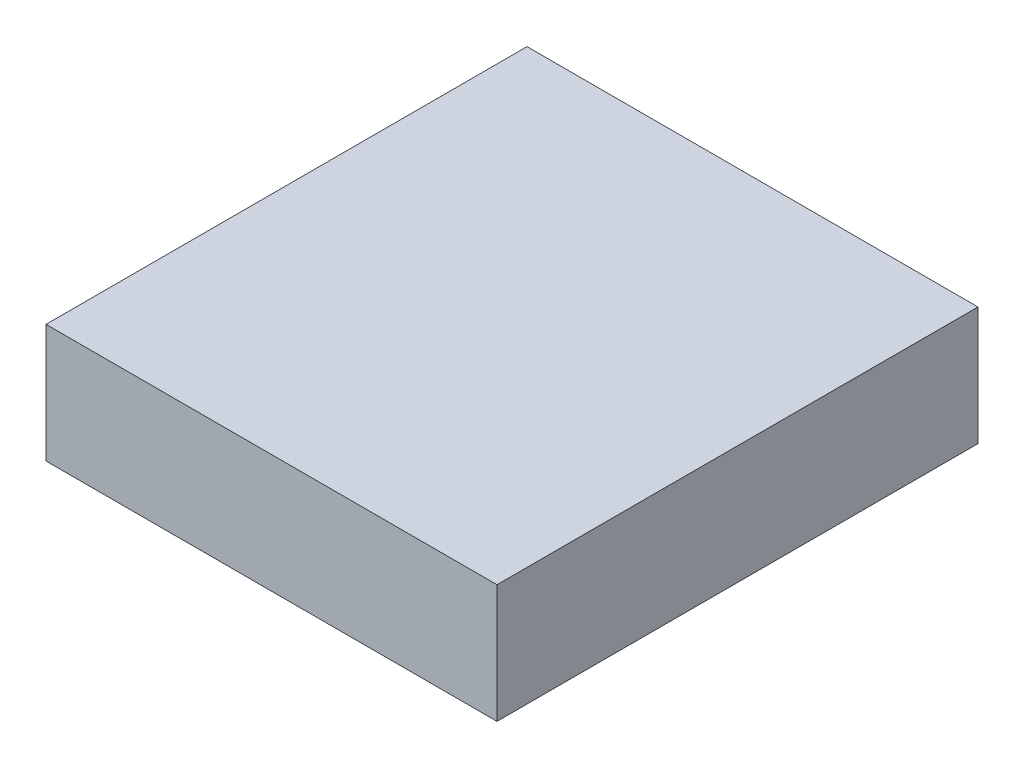
ISO-10303-21;
HEADER;
FILE_DESCRIPTION(('STEP AP214'),'2;1');
FILE_NAME('part.step','',(''),(''),'','','');
FILE_SCHEMA(('AUTOMOTIVE_DESIGN { 1 0 10303 214 1 1 1 1 }'));
ENDSEC;
DATA;
#1=APPLICATION_CONTEXT('core data for automotive mechanical design processes');
#2=APPLICATION_PROTOCOL_DEFINITION('international standard','automotive_design',2000,#1);
#3=PRODUCT_CONTEXT('',#1,'mechanical');
#4=PRODUCT('Part','Part','',(#3));
#5=PRODUCT_RELATED_PRODUCT_CATEGORY('part','',(#4));
#6=PRODUCT_DEFINITION_FORMATION('','',#4);
#7=PRODUCT_DEFINITION_CONTEXT('part definition',#1,'design');
#8=PRODUCT_DEFINITION('design','',#6,#7);
#9=PRODUCT_DEFINITION_SHAPE('','',#8);
#10=(LENGTH_UNIT() NAMED_UNIT(*) SI_UNIT(.MILLI.,.METRE.));
#11=(NAMED_UNIT(*) PLANE_ANGLE_UNIT() SI_UNIT($,.RADIAN.));
#12=(NAMED_UNIT(*) SI_UNIT($,.STERADIAN.) SOLID_ANGLE_UNIT());
#13=UNCERTAINTY_MEASURE_WITH_UNIT(LENGTH_MEASURE(1.E-05),#10,'distance_accuracy_value','');
#14=(GEOMETRIC_REPRESENTATION_CONTEXT(3) GLOBAL_UNCERTAINTY_ASSIGNED_CONTEXT((#13)) GLOBAL_UNIT_ASSIGNED_CONTEXT((#10,
#11,#12)) REPRESENTATION_CONTEXT('',''));
#15=CARTESIAN_POINT('',(0.,0.,0.));
#16=DIRECTION('',(0.,0.,1.));
#17=DIRECTION('',(1.,0.,0.));
#18=AXIS2_PLACEMENT_3D('',#15,#16,#17);
#19=CARTESIAN_POINT('',(47.625,25.,-50.8));
#20=DIRECTION('',(-1.,0.,0.));
#21=DIRECTION('',(0.,0.,1.));
#22=AXIS2_PLACEMENT_3D('',#19,#20,#21);
#23=PLANE('',#22);
#24=DIRECTION('',(0.,0.,-1.));
#25=VECTOR('',#24,1.);
#26=CARTESIAN_POINT('',(47.625,0.,-50.8));
#27=LINE('',#26,#25);
#28=CARTESIAN_POINT('',(47.625,0.,50.8));
#29=VERTEX_POINT('',#28);
#30=CARTESIAN_POINT('',(47.625,0.,-50.8));
#31=VERTEX_POINT('',#30);
#32=EDGE_CURVE('E96',#29,#31,#27,.T.);
#33=ORIENTED_EDGE('',*,*,#32,.T.);
#34=DIRECTION('',(0.,-1.,0.));
#35=VECTOR('',#34,1.);
#36=CARTESIAN_POINT('',(47.625,25.,-50.8));
#37=LINE('',#36,#35);
#38=CARTESIAN_POINT('',(47.625,25.,-50.8));
#39=VERTEX_POINT('',#38);
#40=EDGE_CURVE('E11',#39,#31,#37,.T.);
#41=ORIENTED_EDGE('',*,*,#40,.F.);
#42=DIRECTION('',(0.,0.,-1.));
#43=VECTOR('',#42,1.);
#44=CARTESIAN_POINT('',(47.625,25.,-50.8));
#45=LINE('',#44,#43);
#46=CARTESIAN_POINT('',(47.625,25.,50.8));
#47=VERTEX_POINT('',#46);
#48=EDGE_CURVE('E84',#47,#39,#45,.T.);
#49=ORIENTED_EDGE('',*,*,#48,.F.);
#50=DIRECTION('',(0.,-1.,0.));
#51=VECTOR('',#50,1.);
#52=CARTESIAN_POINT('',(47.625,25.,50.8));
#53=LINE('',#52,#51);
#54=EDGE_CURVE('E92',#47,#29,#53,.T.);
#55=ORIENTED_EDGE('',*,*,#54,.T.);
#56=EDGE_LOOP('',(#33,#41,#49,#55));
#57=FACE_BOUND('',#56,.T.);
#58=ADVANCED_FACE('F33',(#57),#23,.F.);
#59=CARTESIAN_POINT('',(-47.625,25.,-50.8));
#60=DIRECTION('',(0.,0.,1.));
#61=DIRECTION('',(1.,0.,0.));
#62=AXIS2_PLACEMENT_3D('',#59,#60,#61);
#63=PLANE('',#62);
#64=DIRECTION('',(-1.,0.,0.));
#65=VECTOR('',#64,1.);
#66=CARTESIAN_POINT('',(-47.625,0.,-50.8));
#67=LINE('',#66,#65);
#68=CARTESIAN_POINT('',(-47.625,0.,-50.8));
#69=VERTEX_POINT('',#68);
#70=EDGE_CURVE('E88',#31,#69,#67,.T.);
#71=ORIENTED_EDGE('',*,*,#70,.T.);
#72=DIRECTION('',(0.,-1.,0.));
#73=VECTOR('',#72,1.);
#74=CARTESIAN_POINT('',(-47.625,25.,-50.8));
#75=LINE('',#74,#73);
#76=CARTESIAN_POINT('',(-47.625,25.,-50.8));
#77=VERTEX_POINT('',#76);
#78=EDGE_CURVE('E41',#77,#69,#75,.T.);
#79=ORIENTED_EDGE('',*,*,#78,.F.);
#80=DIRECTION('',(-1.,0.,0.));
#81=VECTOR('',#80,1.);
#82=CARTESIAN_POINT('',(-47.625,25.,-50.8));
#83=LINE('',#82,#81);
#84=EDGE_CURVE('E79',#39,#77,#83,.T.);
#85=ORIENTED_EDGE('',*,*,#84,.F.);
#86=ORIENTED_EDGE('',*,*,#40,.T.);
#87=EDGE_LOOP('',(#71,#79,#85,#86));
#88=FACE_BOUND('',#87,.T.);
#89=ADVANCED_FACE('F87',(#88),#63,.F.);
#90=CARTESIAN_POINT('',(-47.625,25.,-50.8));
#91=DIRECTION('',(1.,0.,0.));
#92=DIRECTION('',(0.,0.,-1.));
#93=AXIS2_PLACEMENT_3D('',#90,#91,#92);
#94=PLANE('',#93);
#95=DIRECTION('',(0.,0.,1.));
#96=VECTOR('',#95,1.);
#97=CARTESIAN_POINT('',(-47.625,0.,-50.8));
#98=LINE('',#97,#96);
#99=CARTESIAN_POINT('',(-47.625,0.,50.8));
#100=VERTEX_POINT('',#99);
#101=EDGE_CURVE('E66',#69,#100,#98,.T.);
#102=ORIENTED_EDGE('',*,*,#101,.T.);
#103=DIRECTION('',(0.,-1.,0.));
#104=VECTOR('',#103,1.);
#105=CARTESIAN_POINT('',(-47.625,25.,50.8));
#106=LINE('',#105,#104);
#107=CARTESIAN_POINT('',(-47.625,25.,50.8));
#108=VERTEX_POINT('',#107);
#109=EDGE_CURVE('E89',#108,#100,#106,.T.);
#110=ORIENTED_EDGE('',*,*,#109,.F.);
#111=DIRECTION('',(0.,0.,1.));
#112=VECTOR('',#111,1.);
#113=CARTESIAN_POINT('',(-47.625,25.,-50.8));
#114=LINE('',#113,#112);
#115=EDGE_CURVE('E82',#77,#108,#114,.T.);
#116=ORIENTED_EDGE('',*,*,#115,.F.);
#117=ORIENTED_EDGE('',*,*,#78,.T.);
#118=EDGE_LOOP('',(#102,#110,#116,#117));
#119=FACE_BOUND('',#118,.T.);
#120=ADVANCED_FACE('F90',(#119),#94,.F.);
#121=CARTESIAN_POINT('',(-47.625,25.,50.8));
#122=DIRECTION('',(0.,0.,-1.));
#123=DIRECTION('',(-1.,0.,0.));
#124=AXIS2_PLACEMENT_3D('',#121,#122,#123);
#125=PLANE('',#124);
#126=DIRECTION('',(1.,0.,0.));
#127=VECTOR('',#126,1.);
#128=CARTESIAN_POINT('',(-47.625,0.,50.8));
#129=LINE('',#128,#127);
#130=EDGE_CURVE('E72',#100,#29,#129,.T.);
#131=ORIENTED_EDGE('',*,*,#130,.T.);
#132=ORIENTED_EDGE('',*,*,#54,.F.);
#133=DIRECTION('',(1.,0.,0.));
#134=VECTOR('',#133,1.);
#135=CARTESIAN_POINT('',(-47.625,25.,50.8));
#136=LINE('',#135,#134);
#137=EDGE_CURVE('E49',#108,#47,#136,.T.);
#138=ORIENTED_EDGE('',*,*,#137,.F.);
#139=ORIENTED_EDGE('',*,*,#109,.T.);
#140=EDGE_LOOP('',(#131,#132,#138,#139));
#141=FACE_BOUND('',#140,.T.);
#142=ADVANCED_FACE('F103',(#141),#125,.F.);
#143=CARTESIAN_POINT('',(0.,25.,0.));
#144=DIRECTION('',(0.,1.,0.));
#145=DIRECTION('',(0.,0.,1.));
#146=AXIS2_PLACEMENT_3D('',#143,#144,#145);
#147=PLANE('',#146);
#148=ORIENTED_EDGE('',*,*,#48,.T.);
#149=ORIENTED_EDGE('',*,*,#84,.T.);
#150=ORIENTED_EDGE('',*,*,#115,.T.);
#151=ORIENTED_EDGE('',*,*,#137,.T.);
#152=EDGE_LOOP('',(#148,#149,#150,#151));
#153=FACE_BOUND('',#152,.T.);
#154=ADVANCED_FACE('F80',(#153),#147,.T.);
#155=CARTESIAN_POINT('',(0.,0.,0.));
#156=DIRECTION('',(0.,1.,0.));
#157=DIRECTION('',(0.,0.,1.));
#158=AXIS2_PLACEMENT_3D('',#155,#156,#157);
#159=PLANE('',#158);
#160=ORIENTED_EDGE('',*,*,#32,.F.);
#161=ORIENTED_EDGE('',*,*,#130,.F.);
#162=ORIENTED_EDGE('',*,*,#101,.F.);
#163=ORIENTED_EDGE('',*,*,#70,.F.);
#164=EDGE_LOOP('',(#160,#161,#162,#163));
#165=FACE_BOUND('',#164,.T.);
#166=ADVANCED_FACE('F106',(#165),#159,.F.);
#167=CLOSED_SHELL('',(#58,#89,#120,#142,#154,#166));
#168=MANIFOLD_SOLID_BREP('B2',#167);
#169=ADVANCED_BREP_SHAPE_REPRESENTATION('',(#18,#168),#14);
#170=SHAPE_DEFINITION_REPRESENTATION(#9,#169);
ENDSEC;
END-ISO-10303-21;
